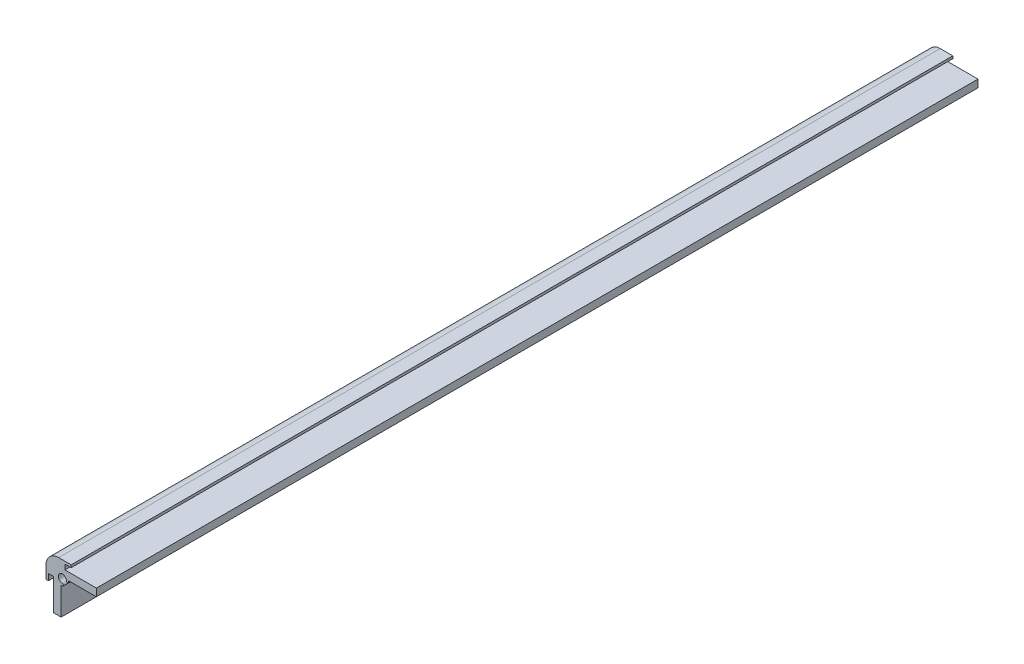
ISO-10303-21;
HEADER;
FILE_DESCRIPTION(('STEP AP214'),'2;1');
FILE_NAME('part.step','',(''),(''),'','','');
FILE_SCHEMA(('AUTOMOTIVE_DESIGN { 1 0 10303 214 1 1 1 1 }'));
ENDSEC;
DATA;
#1=APPLICATION_CONTEXT('core data for automotive mechanical design processes');
#2=APPLICATION_PROTOCOL_DEFINITION('international standard','automotive_design',2000,#1);
#3=PRODUCT_CONTEXT('',#1,'mechanical');
#4=PRODUCT('Part','Part','',(#3));
#5=PRODUCT_RELATED_PRODUCT_CATEGORY('part','',(#4));
#6=PRODUCT_DEFINITION_FORMATION('','',#4);
#7=PRODUCT_DEFINITION_CONTEXT('part definition',#1,'design');
#8=PRODUCT_DEFINITION('design','',#6,#7);
#9=PRODUCT_DEFINITION_SHAPE('','',#8);
#10=(LENGTH_UNIT() NAMED_UNIT(*) SI_UNIT(.MILLI.,.METRE.));
#11=(NAMED_UNIT(*) PLANE_ANGLE_UNIT() SI_UNIT($,.RADIAN.));
#12=(NAMED_UNIT(*) SI_UNIT($,.STERADIAN.) SOLID_ANGLE_UNIT());
#13=UNCERTAINTY_MEASURE_WITH_UNIT(LENGTH_MEASURE(1.E-05),#10,'distance_accuracy_value','');
#14=(GEOMETRIC_REPRESENTATION_CONTEXT(3) GLOBAL_UNCERTAINTY_ASSIGNED_CONTEXT((#13)) GLOBAL_UNIT_ASSIGNED_CONTEXT((#10,
#11,#12)) REPRESENTATION_CONTEXT('',''));
#15=CARTESIAN_POINT('',(0.,0.,0.));
#16=DIRECTION('',(0.,0.,1.));
#17=DIRECTION('',(1.,0.,0.));
#18=AXIS2_PLACEMENT_3D('',#15,#16,#17);
#19=CARTESIAN_POINT('',(1340.13855424615,800.862554256931,350.));
#20=DIRECTION('',(0.,0.,-1.));
#21=DIRECTION('',(-1.,0.,0.));
#22=AXIS2_PLACEMENT_3D('',#19,#20,#21);
#23=CYLINDRICAL_SURFACE('',#22,4.99999999999995);
#24=CARTESIAN_POINT('',(1340.13855424615,800.862554256931,0.));
#25=DIRECTION('',(0.,0.,1.));
#26=DIRECTION('',(1.,0.,0.));
#27=AXIS2_PLACEMENT_3D('',#24,#25,#26);
#28=CIRCLE('',#27,4.99999999999995);
#29=CARTESIAN_POINT('',(1340.13855424615,805.862554256931,0.));
#30=VERTEX_POINT('',#29);
#31=CARTESIAN_POINT('',(1335.13855424615,800.862554256931,0.));
#32=VERTEX_POINT('',#31);
#33=EDGE_CURVE('E202',#30,#32,#28,.T.);
#34=ORIENTED_EDGE('',*,*,#33,.T.);
#35=DIRECTION('',(0.,0.,-1.));
#36=VECTOR('',#35,1.);
#37=CARTESIAN_POINT('',(1335.13855424615,800.862554256931,350.));
#38=LINE('',#37,#36);
#39=CARTESIAN_POINT('',(1335.13855424615,800.862554256931,350.));
#40=VERTEX_POINT('',#39);
#41=EDGE_CURVE('E11',#40,#32,#38,.T.);
#42=ORIENTED_EDGE('',*,*,#41,.F.);
#43=CARTESIAN_POINT('',(1340.13855424615,800.862554256931,350.));
#44=DIRECTION('',(0.,0.,1.));
#45=DIRECTION('',(1.,0.,0.));
#46=AXIS2_PLACEMENT_3D('',#43,#44,#45);
#47=CIRCLE('',#46,4.99999999999995);
#48=CARTESIAN_POINT('',(1340.13855424615,805.862554256931,350.));
#49=VERTEX_POINT('',#48);
#50=EDGE_CURVE('E240',#49,#40,#47,.T.);
#51=ORIENTED_EDGE('',*,*,#50,.F.);
#52=DIRECTION('',(0.,0.,-1.));
#53=VECTOR('',#52,1.);
#54=CARTESIAN_POINT('',(1340.13855424615,805.862554256931,350.));
#55=LINE('',#54,#53);
#56=EDGE_CURVE('E198',#49,#30,#55,.T.);
#57=ORIENTED_EDGE('',*,*,#56,.T.);
#58=EDGE_LOOP('',(#34,#42,#51,#57));
#59=FACE_BOUND('',#58,.T.);
#60=ADVANCED_FACE('F34',(#59),#23,.T.);
#61=CARTESIAN_POINT('',(1335.13855424615,800.862554256931,350.));
#62=DIRECTION('',(1.,0.,0.));
#63=DIRECTION('',(0.,0.,-1.));
#64=AXIS2_PLACEMENT_3D('',#61,#62,#63);
#65=PLANE('',#64);
#66=DIRECTION('',(0.,-1.,0.));
#67=VECTOR('',#66,1.);
#68=CARTESIAN_POINT('',(1335.13855424615,800.862554256931,0.));
#69=LINE('',#68,#67);
#70=CARTESIAN_POINT('',(1335.13855424615,795.862554256931,0.));
#71=VERTEX_POINT('',#70);
#72=EDGE_CURVE('E205',#32,#71,#69,.T.);
#73=ORIENTED_EDGE('',*,*,#72,.T.);
#74=DIRECTION('',(0.,0.,-1.));
#75=VECTOR('',#74,1.);
#76=CARTESIAN_POINT('',(1335.13855424615,795.862554256931,350.));
#77=LINE('',#76,#75);
#78=CARTESIAN_POINT('',(1335.13855424615,795.862554256931,350.));
#79=VERTEX_POINT('',#78);
#80=EDGE_CURVE('E42',#79,#71,#77,.T.);
#81=ORIENTED_EDGE('',*,*,#80,.F.);
#82=DIRECTION('',(0.,-1.,0.));
#83=VECTOR('',#82,1.);
#84=CARTESIAN_POINT('',(1335.13855424615,800.862554256931,350.));
#85=LINE('',#84,#83);
#86=EDGE_CURVE('E129',#40,#79,#85,.T.);
#87=ORIENTED_EDGE('',*,*,#86,.F.);
#88=ORIENTED_EDGE('',*,*,#41,.T.);
#89=EDGE_LOOP('',(#73,#81,#87,#88));
#90=FACE_BOUND('',#89,.T.);
#91=ADVANCED_FACE('F358',(#90),#65,.F.);
#92=CARTESIAN_POINT('',(1335.13855424615,795.862554256931,350.));
#93=DIRECTION('',(0.,1.,0.));
#94=DIRECTION('',(0.,0.,1.));
#95=AXIS2_PLACEMENT_3D('',#92,#93,#94);
#96=PLANE('',#95);
#97=DIRECTION('',(1.,0.,0.));
#98=VECTOR('',#97,1.);
#99=CARTESIAN_POINT('',(1335.13855424615,795.862554256931,0.));
#100=LINE('',#99,#98);
#101=CARTESIAN_POINT('',(1336.13855424615,795.862554256931,0.));
#102=VERTEX_POINT('',#101);
#103=EDGE_CURVE('E207',#71,#102,#100,.T.);
#104=ORIENTED_EDGE('',*,*,#103,.T.);
#105=DIRECTION('',(0.,0.,-1.));
#106=VECTOR('',#105,1.);
#107=CARTESIAN_POINT('',(1336.13855424615,795.862554256931,350.));
#108=LINE('',#107,#106);
#109=CARTESIAN_POINT('',(1336.13855424615,795.862554256931,350.));
#110=VERTEX_POINT('',#109);
#111=EDGE_CURVE('E283',#110,#102,#108,.T.);
#112=ORIENTED_EDGE('',*,*,#111,.F.);
#113=DIRECTION('',(1.,0.,0.));
#114=VECTOR('',#113,1.);
#115=CARTESIAN_POINT('',(1335.13855424615,795.862554256931,350.));
#116=LINE('',#115,#114);
#117=EDGE_CURVE('E291',#79,#110,#116,.T.);
#118=ORIENTED_EDGE('',*,*,#117,.F.);
#119=ORIENTED_EDGE('',*,*,#80,.T.);
#120=EDGE_LOOP('',(#104,#112,#118,#119));
#121=FACE_BOUND('',#120,.T.);
#122=ADVANCED_FACE('F289',(#121),#96,.F.);
#123=CARTESIAN_POINT('',(1336.13855424615,795.862554256931,350.));
#124=DIRECTION('',(-1.,0.,0.));
#125=DIRECTION('',(0.,0.,1.));
#126=AXIS2_PLACEMENT_3D('',#123,#124,#125);
#127=PLANE('',#126);
#128=DIRECTION('',(0.,1.,0.));
#129=VECTOR('',#128,1.);
#130=CARTESIAN_POINT('',(1336.13855424615,795.862554256931,0.));
#131=LINE('',#130,#129);
#132=CARTESIAN_POINT('',(1336.13855424615,798.362554256931,0.));
#133=VERTEX_POINT('',#132);
#134=EDGE_CURVE('E209',#102,#133,#131,.T.);
#135=ORIENTED_EDGE('',*,*,#134,.T.);
#136=DIRECTION('',(0.,0.,-1.));
#137=VECTOR('',#136,1.);
#138=CARTESIAN_POINT('',(1336.13855424615,798.362554256931,350.));
#139=LINE('',#138,#137);
#140=CARTESIAN_POINT('',(1336.13855424615,798.362554256931,350.));
#141=VERTEX_POINT('',#140);
#142=EDGE_CURVE('E280',#141,#133,#139,.T.);
#143=ORIENTED_EDGE('',*,*,#142,.F.);
#144=DIRECTION('',(0.,1.,0.));
#145=VECTOR('',#144,1.);
#146=CARTESIAN_POINT('',(1336.13855424615,795.862554256931,350.));
#147=LINE('',#146,#145);
#148=EDGE_CURVE('E309',#110,#141,#147,.T.);
#149=ORIENTED_EDGE('',*,*,#148,.F.);
#150=ORIENTED_EDGE('',*,*,#111,.T.);
#151=EDGE_LOOP('',(#135,#143,#149,#150));
#152=FACE_BOUND('',#151,.T.);
#153=ADVANCED_FACE('F300',(#152),#127,.F.);
#154=CARTESIAN_POINT('',(1336.13855424615,798.362554256931,350.));
#155=DIRECTION('',(0.,1.,0.));
#156=DIRECTION('',(-1.,0.,0.));
#157=AXIS2_PLACEMENT_3D('',#154,#155,#156);
#158=PLANE('',#157);
#159=DIRECTION('',(1.,0.,0.));
#160=VECTOR('',#159,1.);
#161=CARTESIAN_POINT('',(1336.13855424615,798.362554256931,0.));
#162=LINE('',#161,#160);
#163=CARTESIAN_POINT('',(1338.13855424615,798.362554256931,0.));
#164=VERTEX_POINT('',#163);
#165=EDGE_CURVE('E211',#133,#164,#162,.T.);
#166=ORIENTED_EDGE('',*,*,#165,.T.);
#167=DIRECTION('',(0.,0.,-1.));
#168=VECTOR('',#167,1.);
#169=CARTESIAN_POINT('',(1338.13855424615,798.362554256931,350.));
#170=LINE('',#169,#168);
#171=CARTESIAN_POINT('',(1338.13855424615,798.362554256931,350.));
#172=VERTEX_POINT('',#171);
#173=EDGE_CURVE('E277',#172,#164,#170,.T.);
#174=ORIENTED_EDGE('',*,*,#173,.F.);
#175=DIRECTION('',(1.,0.,0.));
#176=VECTOR('',#175,1.);
#177=CARTESIAN_POINT('',(1336.13855424615,798.362554256931,350.));
#178=LINE('',#177,#176);
#179=EDGE_CURVE('E306',#141,#172,#178,.T.);
#180=ORIENTED_EDGE('',*,*,#179,.F.);
#181=ORIENTED_EDGE('',*,*,#142,.T.);
#182=EDGE_LOOP('',(#166,#174,#180,#181));
#183=FACE_BOUND('',#182,.T.);
#184=ADVANCED_FACE('F304',(#183),#158,.F.);
#185=CARTESIAN_POINT('',(1338.13855424615,798.362554256931,350.));
#186=DIRECTION('',(1.,0.,0.));
#187=DIRECTION('',(0.,0.,-1.));
#188=AXIS2_PLACEMENT_3D('',#185,#186,#187);
#189=PLANE('',#188);
#190=DIRECTION('',(0.,-1.,0.));
#191=VECTOR('',#190,1.);
#192=CARTESIAN_POINT('',(1338.13855424615,798.362554256931,0.));
#193=LINE('',#192,#191);
#194=CARTESIAN_POINT('',(1338.13855424615,785.862554256931,0.));
#195=VERTEX_POINT('',#194);
#196=EDGE_CURVE('E213',#164,#195,#193,.T.);
#197=ORIENTED_EDGE('',*,*,#196,.T.);
#198=DIRECTION('',(0.,0.,-1.));
#199=VECTOR('',#198,1.);
#200=CARTESIAN_POINT('',(1338.13855424615,785.862554256931,350.));
#201=LINE('',#200,#199);
#202=CARTESIAN_POINT('',(1338.13855424615,785.862554256931,350.));
#203=VERTEX_POINT('',#202);
#204=EDGE_CURVE('E274',#203,#195,#201,.T.);
#205=ORIENTED_EDGE('',*,*,#204,.F.);
#206=DIRECTION('',(0.,-1.,0.));
#207=VECTOR('',#206,1.);
#208=CARTESIAN_POINT('',(1338.13855424615,798.362554256931,350.));
#209=LINE('',#208,#207);
#210=EDGE_CURVE('E308',#172,#203,#209,.T.);
#211=ORIENTED_EDGE('',*,*,#210,.F.);
#212=ORIENTED_EDGE('',*,*,#173,.T.);
#213=EDGE_LOOP('',(#197,#205,#211,#212));
#214=FACE_BOUND('',#213,.T.);
#215=ADVANCED_FACE('F371',(#214),#189,.F.);
#216=CARTESIAN_POINT('',(1338.13855424615,785.862554256931,350.));
#217=DIRECTION('',(0.,1.,0.));
#218=DIRECTION('',(0.,0.,1.));
#219=AXIS2_PLACEMENT_3D('',#216,#217,#218);
#220=PLANE('',#219);
#221=DIRECTION('',(1.,0.,0.));
#222=VECTOR('',#221,1.);
#223=CARTESIAN_POINT('',(1338.13855424615,785.862554256931,0.));
#224=LINE('',#223,#222);
#225=CARTESIAN_POINT('',(1341.13855424615,785.862554256931,0.));
#226=VERTEX_POINT('',#225);
#227=EDGE_CURVE('E215',#195,#226,#224,.T.);
#228=ORIENTED_EDGE('',*,*,#227,.T.);
#229=DIRECTION('',(0.,0.,-1.));
#230=VECTOR('',#229,1.);
#231=CARTESIAN_POINT('',(1341.13855424615,785.862554256931,350.));
#232=LINE('',#231,#230);
#233=CARTESIAN_POINT('',(1341.13855424615,785.862554256931,350.));
#234=VERTEX_POINT('',#233);
#235=EDGE_CURVE('E271',#234,#226,#232,.T.);
#236=ORIENTED_EDGE('',*,*,#235,.F.);
#237=DIRECTION('',(1.,0.,0.));
#238=VECTOR('',#237,1.);
#239=CARTESIAN_POINT('',(1338.13855424615,785.862554256931,350.));
#240=LINE('',#239,#238);
#241=EDGE_CURVE('E311',#203,#234,#240,.T.);
#242=ORIENTED_EDGE('',*,*,#241,.F.);
#243=ORIENTED_EDGE('',*,*,#204,.T.);
#244=EDGE_LOOP('',(#228,#236,#242,#243));
#245=FACE_BOUND('',#244,.T.);
#246=ADVANCED_FACE('F374',(#245),#220,.F.);
#247=CARTESIAN_POINT('',(1341.13855424615,785.862554256931,350.));
#248=DIRECTION('',(-1.,0.,0.));
#249=DIRECTION('',(0.,0.,1.));
#250=AXIS2_PLACEMENT_3D('',#247,#248,#249);
#251=PLANE('',#250);
#252=DIRECTION('',(0.,1.,0.));
#253=VECTOR('',#252,1.);
#254=CARTESIAN_POINT('',(1341.13855424615,785.862554256931,0.));
#255=LINE('',#254,#253);
#256=CARTESIAN_POINT('',(1341.13855424615,796.862554256931,0.));
#257=VERTEX_POINT('',#256);
#258=EDGE_CURVE('E217',#226,#257,#255,.T.);
#259=ORIENTED_EDGE('',*,*,#258,.T.);
#260=DIRECTION('',(0.,0.,-1.));
#261=VECTOR('',#260,1.);
#262=CARTESIAN_POINT('',(1341.13855424615,796.862554256931,350.));
#263=LINE('',#262,#261);
#264=CARTESIAN_POINT('',(1341.13855424615,796.862554256931,350.));
#265=VERTEX_POINT('',#264);
#266=EDGE_CURVE('E268',#265,#257,#263,.T.);
#267=ORIENTED_EDGE('',*,*,#266,.F.);
#268=DIRECTION('',(0.,1.,0.));
#269=VECTOR('',#268,1.);
#270=CARTESIAN_POINT('',(1341.13855424615,785.862554256931,350.));
#271=LINE('',#270,#269);
#272=EDGE_CURVE('E317',#234,#265,#271,.T.);
#273=ORIENTED_EDGE('',*,*,#272,.F.);
#274=ORIENTED_EDGE('',*,*,#235,.T.);
#275=EDGE_LOOP('',(#259,#267,#273,#274));
#276=FACE_BOUND('',#275,.T.);
#277=ADVANCED_FACE('F378',(#276),#251,.F.);
#278=CARTESIAN_POINT('',(1341.13855424615,796.862554256931,350.));
#279=DIRECTION('',(0.,1.,0.));
#280=DIRECTION('',(0.,0.,1.));
#281=AXIS2_PLACEMENT_3D('',#278,#279,#280);
#282=PLANE('',#281);
#283=DIRECTION('',(1.,0.,0.));
#284=VECTOR('',#283,1.);
#285=CARTESIAN_POINT('',(1341.13855424615,796.862554256931,0.));
#286=LINE('',#285,#284);
#287=CARTESIAN_POINT('',(1341.48333088595,796.862554256931,0.));
#288=VERTEX_POINT('',#287);
#289=EDGE_CURVE('E219',#257,#288,#286,.T.);
#290=ORIENTED_EDGE('',*,*,#289,.T.);
#291=DIRECTION('',(0.,0.,-1.));
#292=VECTOR('',#291,1.);
#293=CARTESIAN_POINT('',(1341.48333088595,796.862554256931,350.));
#294=LINE('',#293,#292);
#295=CARTESIAN_POINT('',(1341.48333088595,796.862554256931,350.));
#296=VERTEX_POINT('',#295);
#297=EDGE_CURVE('E265',#296,#288,#294,.T.);
#298=ORIENTED_EDGE('',*,*,#297,.F.);
#299=DIRECTION('',(1.,0.,0.));
#300=VECTOR('',#299,1.);
#301=CARTESIAN_POINT('',(1341.13855424615,796.862554256931,350.));
#302=LINE('',#301,#300);
#303=EDGE_CURVE('E319',#265,#296,#302,.T.);
#304=ORIENTED_EDGE('',*,*,#303,.F.);
#305=ORIENTED_EDGE('',*,*,#266,.T.);
#306=EDGE_LOOP('',(#290,#298,#304,#305));
#307=FACE_BOUND('',#306,.T.);
#308=ADVANCED_FACE('F382',(#307),#282,.F.);
#309=CARTESIAN_POINT('',(1341.63855424615,797.299168539403,350.));
#310=DIRECTION('',(0.,0.,-1.));
#311=DIRECTION('',(-1.,0.,0.));
#312=AXIS2_PLACEMENT_3D('',#309,#310,#311);
#313=CYLINDRICAL_SURFACE('',#312,0.463385717528016);
#314=CARTESIAN_POINT('',(1341.63855424615,797.299168539403,0.));
#315=DIRECTION('',(0.,0.,1.));
#316=DIRECTION('',(1.,0.,0.));
#317=AXIS2_PLACEMENT_3D('',#314,#315,#316);
#318=CIRCLE('',#317,0.463385717528016);
#319=CARTESIAN_POINT('',(1341.63855424615,797.76255425693,0.));
#320=VERTEX_POINT('',#319);
#321=EDGE_CURVE('E221',#288,#320,#318,.T.);
#322=ORIENTED_EDGE('',*,*,#321,.T.);
#323=DIRECTION('',(0.,0.,-1.));
#324=VECTOR('',#323,1.);
#325=CARTESIAN_POINT('',(1341.63855424615,797.76255425693,350.));
#326=LINE('',#325,#324);
#327=CARTESIAN_POINT('',(1341.63855424615,797.76255425693,350.));
#328=VERTEX_POINT('',#327);
#329=EDGE_CURVE('E262',#328,#320,#326,.T.);
#330=ORIENTED_EDGE('',*,*,#329,.F.);
#331=CARTESIAN_POINT('',(1341.63855424615,797.299168539403,350.));
#332=DIRECTION('',(0.,0.,1.));
#333=DIRECTION('',(1.,0.,0.));
#334=AXIS2_PLACEMENT_3D('',#331,#332,#333);
#335=CIRCLE('',#334,0.463385717528016);
#336=EDGE_CURVE('E321',#296,#328,#335,.T.);
#337=ORIENTED_EDGE('',*,*,#336,.F.);
#338=ORIENTED_EDGE('',*,*,#297,.T.);
#339=EDGE_LOOP('',(#322,#330,#337,#338));
#340=FACE_BOUND('',#339,.T.);
#341=ADVANCED_FACE('F386',(#340),#313,.T.);
#342=CARTESIAN_POINT('',(1341.63855424615,799.36255425693,350.));
#343=DIRECTION('',(0.,0.,-1.));
#344=DIRECTION('',(-1.,0.,0.));
#345=AXIS2_PLACEMENT_3D('',#342,#343,#344);
#346=CYLINDRICAL_SURFACE('',#345,1.59999999999988);
#347=CARTESIAN_POINT('',(1341.63855424615,799.36255425693,0.));
#348=DIRECTION('',(0.,0.,-1.));
#349=DIRECTION('',(1.,0.,0.));
#350=AXIS2_PLACEMENT_3D('',#347,#348,#349);
#351=CIRCLE('',#350,1.59999999999988);
#352=CARTESIAN_POINT('',(1343.23855424615,799.362554256931,0.));
#353=VERTEX_POINT('',#352);
#354=EDGE_CURVE('E223',#320,#353,#351,.T.);
#355=ORIENTED_EDGE('',*,*,#354,.T.);
#356=DIRECTION('',(0.,0.,-1.));
#357=VECTOR('',#356,1.);
#358=CARTESIAN_POINT('',(1343.23855424615,799.362554256931,350.));
#359=LINE('',#358,#357);
#360=CARTESIAN_POINT('',(1343.23855424615,799.362554256931,350.));
#361=VERTEX_POINT('',#360);
#362=EDGE_CURVE('E259',#361,#353,#359,.T.);
#363=ORIENTED_EDGE('',*,*,#362,.F.);
#364=CARTESIAN_POINT('',(1341.63855424615,799.36255425693,350.));
#365=DIRECTION('',(0.,0.,-1.));
#366=DIRECTION('',(1.,0.,0.));
#367=AXIS2_PLACEMENT_3D('',#364,#365,#366);
#368=CIRCLE('',#367,1.59999999999988);
#369=EDGE_CURVE('E323',#328,#361,#368,.T.);
#370=ORIENTED_EDGE('',*,*,#369,.F.);
#371=ORIENTED_EDGE('',*,*,#329,.T.);
#372=EDGE_LOOP('',(#355,#363,#370,#371));
#373=FACE_BOUND('',#372,.T.);
#374=ADVANCED_FACE('F390',(#373),#346,.F.);
#375=CARTESIAN_POINT('',(1343.63855424615,799.362554256931,350.));
#376=DIRECTION('',(0.,0.,-1.));
#377=DIRECTION('',(-1.,0.,0.));
#378=AXIS2_PLACEMENT_3D('',#375,#376,#377);
#379=CYLINDRICAL_SURFACE('',#378,0.399999999999956);
#380=CARTESIAN_POINT('',(1343.63855424615,799.362554256931,0.));
#381=DIRECTION('',(0.,0.,1.));
#382=DIRECTION('',(1.,0.,0.));
#383=AXIS2_PLACEMENT_3D('',#380,#381,#382);
#384=CIRCLE('',#383,0.399999999999956);
#385=CARTESIAN_POINT('',(1344.03855424615,799.362554256931,0.));
#386=VERTEX_POINT('',#385);
#387=EDGE_CURVE('E225',#353,#386,#384,.T.);
#388=ORIENTED_EDGE('',*,*,#387,.T.);
#389=DIRECTION('',(0.,0.,-1.));
#390=VECTOR('',#389,1.);
#391=CARTESIAN_POINT('',(1344.03855424615,799.362554256931,350.));
#392=LINE('',#391,#390);
#393=CARTESIAN_POINT('',(1344.03855424615,799.362554256931,350.));
#394=VERTEX_POINT('',#393);
#395=EDGE_CURVE('E256',#394,#386,#392,.T.);
#396=ORIENTED_EDGE('',*,*,#395,.F.);
#397=CARTESIAN_POINT('',(1343.63855424615,799.362554256931,350.));
#398=DIRECTION('',(0.,0.,1.));
#399=DIRECTION('',(1.,0.,0.));
#400=AXIS2_PLACEMENT_3D('',#397,#398,#399);
#401=CIRCLE('',#400,0.399999999999956);
#402=EDGE_CURVE('E325',#361,#394,#401,.T.);
#403=ORIENTED_EDGE('',*,*,#402,.F.);
#404=ORIENTED_EDGE('',*,*,#362,.T.);
#405=EDGE_LOOP('',(#388,#396,#403,#404));
#406=FACE_BOUND('',#405,.T.);
#407=ADVANCED_FACE('F394',(#406),#379,.T.);
#408=CARTESIAN_POINT('',(1344.03855424615,799.362554256931,350.));
#409=DIRECTION('',(-1.,0.,0.));
#410=DIRECTION('',(0.,0.,1.));
#411=AXIS2_PLACEMENT_3D('',#408,#409,#410);
#412=PLANE('',#411);
#413=DIRECTION('',(0.,1.,0.));
#414=VECTOR('',#413,1.);
#415=CARTESIAN_POINT('',(1344.03855424615,799.362554256931,0.));
#416=LINE('',#415,#414);
#417=CARTESIAN_POINT('',(1344.03855424615,799.862554256931,0.));
#418=VERTEX_POINT('',#417);
#419=EDGE_CURVE('E227',#386,#418,#416,.T.);
#420=ORIENTED_EDGE('',*,*,#419,.T.);
#421=DIRECTION('',(0.,0.,-1.));
#422=VECTOR('',#421,1.);
#423=CARTESIAN_POINT('',(1344.03855424615,799.862554256931,350.));
#424=LINE('',#423,#422);
#425=CARTESIAN_POINT('',(1344.03855424615,799.862554256931,350.));
#426=VERTEX_POINT('',#425);
#427=EDGE_CURVE('E253',#426,#418,#424,.T.);
#428=ORIENTED_EDGE('',*,*,#427,.F.);
#429=DIRECTION('',(0.,1.,0.));
#430=VECTOR('',#429,1.);
#431=CARTESIAN_POINT('',(1344.03855424615,799.362554256931,350.));
#432=LINE('',#431,#430);
#433=EDGE_CURVE('E327',#394,#426,#432,.T.);
#434=ORIENTED_EDGE('',*,*,#433,.F.);
#435=ORIENTED_EDGE('',*,*,#395,.T.);
#436=EDGE_LOOP('',(#420,#428,#434,#435));
#437=FACE_BOUND('',#436,.T.);
#438=ADVANCED_FACE('F398',(#437),#412,.F.);
#439=CARTESIAN_POINT('',(1355.13855424615,799.862554256931,350.));
#440=DIRECTION('',(0.,1.,0.));
#441=DIRECTION('',(0.,0.,1.));
#442=AXIS2_PLACEMENT_3D('',#439,#440,#441);
#443=PLANE('',#442);
#444=DIRECTION('',(1.,0.,0.));
#445=VECTOR('',#444,1.);
#446=CARTESIAN_POINT('',(1355.13855424615,799.862554256931,0.));
#447=LINE('',#446,#445);
#448=CARTESIAN_POINT('',(1355.13855424615,799.862554256931,0.));
#449=VERTEX_POINT('',#448);
#450=EDGE_CURVE('E229',#418,#449,#447,.T.);
#451=ORIENTED_EDGE('',*,*,#450,.T.);
#452=DIRECTION('',(0.,0.,-1.));
#453=VECTOR('',#452,1.);
#454=CARTESIAN_POINT('',(1355.13855424615,799.862554256931,350.));
#455=LINE('',#454,#453);
#456=CARTESIAN_POINT('',(1355.13855424615,799.862554256931,350.));
#457=VERTEX_POINT('',#456);
#458=EDGE_CURVE('E250',#457,#449,#455,.T.);
#459=ORIENTED_EDGE('',*,*,#458,.F.);
#460=DIRECTION('',(1.,0.,0.));
#461=VECTOR('',#460,1.);
#462=CARTESIAN_POINT('',(1355.13855424615,799.862554256931,350.));
#463=LINE('',#462,#461);
#464=EDGE_CURVE('E329',#426,#457,#463,.T.);
#465=ORIENTED_EDGE('',*,*,#464,.F.);
#466=ORIENTED_EDGE('',*,*,#427,.T.);
#467=EDGE_LOOP('',(#451,#459,#465,#466));
#468=FACE_BOUND('',#467,.T.);
#469=ADVANCED_FACE('F402',(#468),#443,.F.);
#470=CARTESIAN_POINT('',(1355.13855424615,802.862554256931,350.));
#471=DIRECTION('',(-1.,0.,0.));
#472=DIRECTION('',(0.,0.,1.));
#473=AXIS2_PLACEMENT_3D('',#470,#471,#472);
#474=PLANE('',#473);
#475=DIRECTION('',(0.,1.,0.));
#476=VECTOR('',#475,1.);
#477=CARTESIAN_POINT('',(1355.13855424615,802.862554256931,0.));
#478=LINE('',#477,#476);
#479=CARTESIAN_POINT('',(1355.13855424615,802.862554256931,0.));
#480=VERTEX_POINT('',#479);
#481=EDGE_CURVE('E231',#449,#480,#478,.T.);
#482=ORIENTED_EDGE('',*,*,#481,.T.);
#483=DIRECTION('',(0.,0.,-1.));
#484=VECTOR('',#483,1.);
#485=CARTESIAN_POINT('',(1355.13855424615,802.862554256931,350.));
#486=LINE('',#485,#484);
#487=CARTESIAN_POINT('',(1355.13855424615,802.862554256931,350.));
#488=VERTEX_POINT('',#487);
#489=EDGE_CURVE('E247',#488,#480,#486,.T.);
#490=ORIENTED_EDGE('',*,*,#489,.F.);
#491=DIRECTION('',(0.,1.,0.));
#492=VECTOR('',#491,1.);
#493=CARTESIAN_POINT('',(1355.13855424615,802.862554256931,350.));
#494=LINE('',#493,#492);
#495=EDGE_CURVE('E331',#457,#488,#494,.T.);
#496=ORIENTED_EDGE('',*,*,#495,.F.);
#497=ORIENTED_EDGE('',*,*,#458,.T.);
#498=EDGE_LOOP('',(#482,#490,#496,#497));
#499=FACE_BOUND('',#498,.T.);
#500=ADVANCED_FACE('F406',(#499),#474,.F.);
#501=CARTESIAN_POINT('',(1342.63855424615,802.862554256931,350.));
#502=DIRECTION('',(0.,-1.,0.));
#503=DIRECTION('',(0.,0.,-1.));
#504=AXIS2_PLACEMENT_3D('',#501,#502,#503);
#505=PLANE('',#504);
#506=DIRECTION('',(-1.,0.,0.));
#507=VECTOR('',#506,1.);
#508=CARTESIAN_POINT('',(1342.63855424615,802.862554256931,0.));
#509=LINE('',#508,#507);
#510=CARTESIAN_POINT('',(1342.63855424615,802.862554256931,0.));
#511=VERTEX_POINT('',#510);
#512=EDGE_CURVE('E233',#480,#511,#509,.T.);
#513=ORIENTED_EDGE('',*,*,#512,.T.);
#514=DIRECTION('',(0.,0.,-1.));
#515=VECTOR('',#514,1.);
#516=CARTESIAN_POINT('',(1342.63855424615,802.862554256931,350.));
#517=LINE('',#516,#515);
#518=CARTESIAN_POINT('',(1342.63855424615,802.862554256931,350.));
#519=VERTEX_POINT('',#518);
#520=EDGE_CURVE('E244',#519,#511,#517,.T.);
#521=ORIENTED_EDGE('',*,*,#520,.F.);
#522=DIRECTION('',(-1.,0.,0.));
#523=VECTOR('',#522,1.);
#524=CARTESIAN_POINT('',(1342.63855424615,802.862554256931,350.));
#525=LINE('',#524,#523);
#526=EDGE_CURVE('E333',#488,#519,#525,.T.);
#527=ORIENTED_EDGE('',*,*,#526,.F.);
#528=ORIENTED_EDGE('',*,*,#489,.T.);
#529=EDGE_LOOP('',(#513,#521,#527,#528));
#530=FACE_BOUND('',#529,.T.);
#531=ADVANCED_FACE('F339',(#530),#505,.F.);
#532=CARTESIAN_POINT('',(1342.63855424615,804.862554256931,350.));
#533=DIRECTION('',(-1.,0.,0.));
#534=DIRECTION('',(0.,0.,1.));
#535=AXIS2_PLACEMENT_3D('',#532,#533,#534);
#536=PLANE('',#535);
#537=DIRECTION('',(0.,1.,0.));
#538=VECTOR('',#537,1.);
#539=CARTESIAN_POINT('',(1342.63855424615,804.862554256931,0.));
#540=LINE('',#539,#538);
#541=CARTESIAN_POINT('',(1342.63855424615,804.862554256931,0.));
#542=VERTEX_POINT('',#541);
#543=EDGE_CURVE('E235',#511,#542,#540,.T.);
#544=ORIENTED_EDGE('',*,*,#543,.T.);
#545=DIRECTION('',(0.,0.,-1.));
#546=VECTOR('',#545,1.);
#547=CARTESIAN_POINT('',(1342.63855424615,804.862554256931,350.));
#548=LINE('',#547,#546);
#549=CARTESIAN_POINT('',(1342.63855424615,804.862554256931,350.));
#550=VERTEX_POINT('',#549);
#551=EDGE_CURVE('E193',#550,#542,#548,.T.);
#552=ORIENTED_EDGE('',*,*,#551,.F.);
#553=DIRECTION('',(0.,1.,0.));
#554=VECTOR('',#553,1.);
#555=CARTESIAN_POINT('',(1342.63855424615,804.862554256931,350.));
#556=LINE('',#555,#554);
#557=EDGE_CURVE('E184',#519,#550,#556,.T.);
#558=ORIENTED_EDGE('',*,*,#557,.F.);
#559=ORIENTED_EDGE('',*,*,#520,.T.);
#560=EDGE_LOOP('',(#544,#552,#558,#559));
#561=FACE_BOUND('',#560,.T.);
#562=ADVANCED_FACE('F343',(#561),#536,.F.);
#563=CARTESIAN_POINT('',(1345.13855424615,804.862554256931,350.));
#564=DIRECTION('',(0.,1.,0.));
#565=DIRECTION('',(0.,0.,1.));
#566=AXIS2_PLACEMENT_3D('',#563,#564,#565);
#567=PLANE('',#566);
#568=DIRECTION('',(1.,0.,0.));
#569=VECTOR('',#568,1.);
#570=CARTESIAN_POINT('',(1345.13855424615,804.862554256931,0.));
#571=LINE('',#570,#569);
#572=CARTESIAN_POINT('',(1345.13855424615,804.862554256931,0.));
#573=VERTEX_POINT('',#572);
#574=EDGE_CURVE('E192',#542,#573,#571,.T.);
#575=ORIENTED_EDGE('',*,*,#574,.T.);
#576=DIRECTION('',(0.,0.,-1.));
#577=VECTOR('',#576,1.);
#578=CARTESIAN_POINT('',(1345.13855424615,804.862554256931,350.));
#579=LINE('',#578,#577);
#580=CARTESIAN_POINT('',(1345.13855424615,804.862554256931,350.));
#581=VERTEX_POINT('',#580);
#582=EDGE_CURVE('E189',#581,#573,#579,.T.);
#583=ORIENTED_EDGE('',*,*,#582,.F.);
#584=DIRECTION('',(1.,0.,0.));
#585=VECTOR('',#584,1.);
#586=CARTESIAN_POINT('',(1345.13855424615,804.862554256931,350.));
#587=LINE('',#586,#585);
#588=EDGE_CURVE('E178',#550,#581,#587,.T.);
#589=ORIENTED_EDGE('',*,*,#588,.F.);
#590=ORIENTED_EDGE('',*,*,#551,.T.);
#591=EDGE_LOOP('',(#575,#583,#589,#590));
#592=FACE_BOUND('',#591,.T.);
#593=ADVANCED_FACE('F190',(#592),#567,.F.);
#594=CARTESIAN_POINT('',(1345.13855424615,805.862554256931,350.));
#595=DIRECTION('',(-1.,0.,0.));
#596=DIRECTION('',(0.,0.,1.));
#597=AXIS2_PLACEMENT_3D('',#594,#595,#596);
#598=PLANE('',#597);
#599=DIRECTION('',(0.,1.,0.));
#600=VECTOR('',#599,1.);
#601=CARTESIAN_POINT('',(1345.13855424615,805.862554256931,0.));
#602=LINE('',#601,#600);
#603=CARTESIAN_POINT('',(1345.13855424615,805.862554256931,0.));
#604=VERTEX_POINT('',#603);
#605=EDGE_CURVE('E115',#573,#604,#602,.T.);
#606=ORIENTED_EDGE('',*,*,#605,.T.);
#607=DIRECTION('',(0.,0.,-1.));
#608=VECTOR('',#607,1.);
#609=CARTESIAN_POINT('',(1345.13855424615,805.862554256931,350.));
#610=LINE('',#609,#608);
#611=CARTESIAN_POINT('',(1345.13855424615,805.862554256931,350.));
#612=VERTEX_POINT('',#611);
#613=EDGE_CURVE('E194',#612,#604,#610,.T.);
#614=ORIENTED_EDGE('',*,*,#613,.F.);
#615=DIRECTION('',(0.,1.,0.));
#616=VECTOR('',#615,1.);
#617=CARTESIAN_POINT('',(1345.13855424615,805.862554256931,350.));
#618=LINE('',#617,#616);
#619=EDGE_CURVE('E182',#581,#612,#618,.T.);
#620=ORIENTED_EDGE('',*,*,#619,.F.);
#621=ORIENTED_EDGE('',*,*,#582,.T.);
#622=EDGE_LOOP('',(#606,#614,#620,#621));
#623=FACE_BOUND('',#622,.T.);
#624=ADVANCED_FACE('F196',(#623),#598,.F.);
#625=CARTESIAN_POINT('',(1340.13855424615,805.862554256931,350.));
#626=DIRECTION('',(0.,-1.,0.));
#627=DIRECTION('',(0.,0.,-1.));
#628=AXIS2_PLACEMENT_3D('',#625,#626,#627);
#629=PLANE('',#628);
#630=DIRECTION('',(-1.,0.,0.));
#631=VECTOR('',#630,1.);
#632=CARTESIAN_POINT('',(1340.13855424615,805.862554256931,0.));
#633=LINE('',#632,#631);
#634=EDGE_CURVE('E121',#604,#30,#633,.T.);
#635=ORIENTED_EDGE('',*,*,#634,.T.);
#636=ORIENTED_EDGE('',*,*,#56,.F.);
#637=DIRECTION('',(-1.,0.,0.));
#638=VECTOR('',#637,1.);
#639=CARTESIAN_POINT('',(1340.13855424615,805.862554256931,350.));
#640=LINE('',#639,#638);
#641=EDGE_CURVE('E50',#612,#49,#640,.T.);
#642=ORIENTED_EDGE('',*,*,#641,.F.);
#643=ORIENTED_EDGE('',*,*,#613,.T.);
#644=EDGE_LOOP('',(#635,#636,#642,#643));
#645=FACE_BOUND('',#644,.T.);
#646=ADVANCED_FACE('F347',(#645),#629,.F.);
#647=CARTESIAN_POINT('',(1340.13855424615,800.862554256931,350.));
#648=DIRECTION('',(0.,0.,1.));
#649=DIRECTION('',(1.,0.,0.));
#650=AXIS2_PLACEMENT_3D('',#647,#648,#649);
#651=PLANE('',#650);
#652=ORIENTED_EDGE('',*,*,#50,.T.);
#653=ORIENTED_EDGE('',*,*,#86,.T.);
#654=ORIENTED_EDGE('',*,*,#117,.T.);
#655=ORIENTED_EDGE('',*,*,#148,.T.);
#656=ORIENTED_EDGE('',*,*,#179,.T.);
#657=ORIENTED_EDGE('',*,*,#210,.T.);
#658=ORIENTED_EDGE('',*,*,#241,.T.);
#659=ORIENTED_EDGE('',*,*,#272,.T.);
#660=ORIENTED_EDGE('',*,*,#303,.T.);
#661=ORIENTED_EDGE('',*,*,#336,.T.);
#662=ORIENTED_EDGE('',*,*,#369,.T.);
#663=ORIENTED_EDGE('',*,*,#402,.T.);
#664=ORIENTED_EDGE('',*,*,#433,.T.);
#665=ORIENTED_EDGE('',*,*,#464,.T.);
#666=ORIENTED_EDGE('',*,*,#495,.T.);
#667=ORIENTED_EDGE('',*,*,#526,.T.);
#668=ORIENTED_EDGE('',*,*,#557,.T.);
#669=ORIENTED_EDGE('',*,*,#588,.T.);
#670=ORIENTED_EDGE('',*,*,#619,.T.);
#671=ORIENTED_EDGE('',*,*,#641,.T.);
#672=EDGE_LOOP('',(#652,#653,#654,#655,#656,#657,#658,#659,#660,#661,#662,#663,#664,#665,#666,
#667,#668,#669,#670,#671));
#673=FACE_BOUND('',#672,.T.);
#674=ADVANCED_FACE('F180',(#673),#651,.T.);
#675=CARTESIAN_POINT('',(1340.13855424615,800.862554256931,0.));
#676=DIRECTION('',(0.,0.,1.));
#677=DIRECTION('',(1.,0.,0.));
#678=AXIS2_PLACEMENT_3D('',#675,#676,#677);
#679=PLANE('',#678);
#680=ORIENTED_EDGE('',*,*,#33,.F.);
#681=ORIENTED_EDGE('',*,*,#634,.F.);
#682=ORIENTED_EDGE('',*,*,#605,.F.);
#683=ORIENTED_EDGE('',*,*,#574,.F.);
#684=ORIENTED_EDGE('',*,*,#543,.F.);
#685=ORIENTED_EDGE('',*,*,#512,.F.);
#686=ORIENTED_EDGE('',*,*,#481,.F.);
#687=ORIENTED_EDGE('',*,*,#450,.F.);
#688=ORIENTED_EDGE('',*,*,#419,.F.);
#689=ORIENTED_EDGE('',*,*,#387,.F.);
#690=ORIENTED_EDGE('',*,*,#354,.F.);
#691=ORIENTED_EDGE('',*,*,#321,.F.);
#692=ORIENTED_EDGE('',*,*,#289,.F.);
#693=ORIENTED_EDGE('',*,*,#258,.F.);
#694=ORIENTED_EDGE('',*,*,#227,.F.);
#695=ORIENTED_EDGE('',*,*,#196,.F.);
#696=ORIENTED_EDGE('',*,*,#165,.F.);
#697=ORIENTED_EDGE('',*,*,#134,.F.);
#698=ORIENTED_EDGE('',*,*,#103,.F.);
#699=ORIENTED_EDGE('',*,*,#72,.F.);
#700=EDGE_LOOP('',(#680,#681,#682,#683,#684,#685,#686,#687,#688,#689,#690,#691,#692,#693,#694,
#695,#696,#697,#698,#699));
#701=FACE_BOUND('',#700,.T.);
#702=ADVANCED_FACE('F295',(#701),#679,.F.);
#703=CLOSED_SHELL('',(#60,#91,#122,#153,#184,#215,#246,#277,#308,#341,#374,#407,#438,#469,#500,
#531,#562,#593,#624,#646,#674,#702));
#704=MANIFOLD_SOLID_BREP('B2',#703);
#705=ADVANCED_BREP_SHAPE_REPRESENTATION('',(#18,#704),#14);
#706=SHAPE_DEFINITION_REPRESENTATION(#9,#705);
ENDSEC;
END-ISO-10303-21;
